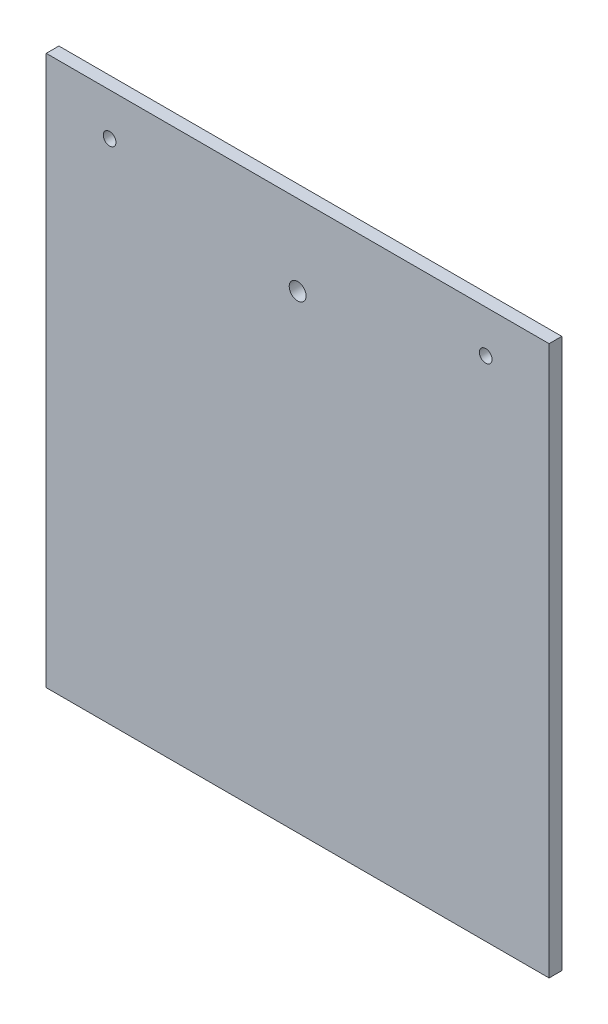
ISO-10303-21;
HEADER;
FILE_DESCRIPTION(('STEP AP214'),'2;1');
FILE_NAME('part.step','',(''),(''),'','','');
FILE_SCHEMA(('AUTOMOTIVE_DESIGN { 1 0 10303 214 1 1 1 1 }'));
ENDSEC;
DATA;
#1=APPLICATION_CONTEXT('core data for automotive mechanical design processes');
#2=APPLICATION_PROTOCOL_DEFINITION('international standard','automotive_design',2000,#1);
#3=PRODUCT_CONTEXT('',#1,'mechanical');
#4=PRODUCT('Part','Part','',(#3));
#5=PRODUCT_RELATED_PRODUCT_CATEGORY('part','',(#4));
#6=PRODUCT_DEFINITION_FORMATION('','',#4);
#7=PRODUCT_DEFINITION_CONTEXT('part definition',#1,'design');
#8=PRODUCT_DEFINITION('design','',#6,#7);
#9=PRODUCT_DEFINITION_SHAPE('','',#8);
#10=(LENGTH_UNIT() NAMED_UNIT(*) SI_UNIT(.MILLI.,.METRE.));
#11=(NAMED_UNIT(*) PLANE_ANGLE_UNIT() SI_UNIT($,.RADIAN.));
#12=(NAMED_UNIT(*) SI_UNIT($,.STERADIAN.) SOLID_ANGLE_UNIT());
#13=UNCERTAINTY_MEASURE_WITH_UNIT(LENGTH_MEASURE(1.E-05),#10,'distance_accuracy_value','');
#14=(GEOMETRIC_REPRESENTATION_CONTEXT(3) GLOBAL_UNCERTAINTY_ASSIGNED_CONTEXT((#13)) GLOBAL_UNIT_ASSIGNED_CONTEXT((#10,
#11,#12)) REPRESENTATION_CONTEXT('',''));
#15=CARTESIAN_POINT('',(0.,0.,0.));
#16=DIRECTION('',(0.,0.,1.));
#17=DIRECTION('',(1.,0.,0.));
#18=AXIS2_PLACEMENT_3D('',#15,#16,#17);
#19=CARTESIAN_POINT('',(0.,0.,3.));
#20=DIRECTION('',(0.,0.,1.));
#21=DIRECTION('',(1.,0.,0.));
#22=AXIS2_PLACEMENT_3D('',#19,#20,#21);
#23=PLANE('',#22);
#24=CARTESIAN_POINT('',(0.,46.,3.));
#25=DIRECTION('',(0.,0.,1.));
#26=DIRECTION('',(1.,0.,0.));
#27=AXIS2_PLACEMENT_3D('',#24,#25,#26);
#28=CIRCLE('',#27,2.);
#29=CARTESIAN_POINT('',(2.,46.,3.));
#30=VERTEX_POINT('',#29);
#31=EDGE_CURVE('E149',#30,#30,#28,.T.);
#32=ORIENTED_EDGE('',*,*,#31,.F.);
#33=EDGE_LOOP('',(#32));
#34=FACE_BOUND('',#33,.T.);
#35=CARTESIAN_POINT('',(-44.5,55.,3.));
#36=DIRECTION('',(0.,0.,-1.));
#37=DIRECTION('',(-1.,0.,0.));
#38=AXIS2_PLACEMENT_3D('',#35,#36,#37);
#39=CIRCLE('',#38,1.5);
#40=CARTESIAN_POINT('',(-46.,55.,3.));
#41=VERTEX_POINT('',#40);
#42=EDGE_CURVE('E137',#41,#41,#39,.T.);
#43=ORIENTED_EDGE('',*,*,#42,.T.);
#44=EDGE_LOOP('',(#43));
#45=FACE_BOUND('',#44,.T.);
#46=DIRECTION('',(0.,-1.,0.));
#47=VECTOR('',#46,1.);
#48=CARTESIAN_POINT('',(-59.5,-65.,3.));
#49=LINE('',#48,#47);
#50=CARTESIAN_POINT('',(-59.5,65.,3.));
#51=VERTEX_POINT('',#50);
#52=CARTESIAN_POINT('',(-59.5,-65.,3.));
#53=VERTEX_POINT('',#52);
#54=EDGE_CURVE('E95',#51,#53,#49,.T.);
#55=ORIENTED_EDGE('',*,*,#54,.T.);
#56=DIRECTION('',(1.,0.,0.));
#57=VECTOR('',#56,1.);
#58=CARTESIAN_POINT('',(59.5,-65.,3.));
#59=LINE('',#58,#57);
#60=CARTESIAN_POINT('',(59.5,-65.,3.));
#61=VERTEX_POINT('',#60);
#62=EDGE_CURVE('E90',#53,#61,#59,.T.);
#63=ORIENTED_EDGE('',*,*,#62,.T.);
#64=DIRECTION('',(0.,1.,0.));
#65=VECTOR('',#64,1.);
#66=CARTESIAN_POINT('',(59.5,-65.,3.));
#67=LINE('',#66,#65);
#68=CARTESIAN_POINT('',(59.5,65.,3.));
#69=VERTEX_POINT('',#68);
#70=EDGE_CURVE('E93',#61,#69,#67,.T.);
#71=ORIENTED_EDGE('',*,*,#70,.T.);
#72=DIRECTION('',(-1.,0.,0.));
#73=VECTOR('',#72,1.);
#74=CARTESIAN_POINT('',(59.5,65.,3.));
#75=LINE('',#74,#73);
#76=EDGE_CURVE('E60',#69,#51,#75,.T.);
#77=ORIENTED_EDGE('',*,*,#76,.T.);
#78=EDGE_LOOP('',(#55,#63,#71,#77));
#79=FACE_BOUND('',#78,.T.);
#80=CARTESIAN_POINT('',(44.5,55.,3.));
#81=DIRECTION('',(0.,0.,1.));
#82=DIRECTION('',(1.,0.,0.));
#83=AXIS2_PLACEMENT_3D('',#80,#81,#82);
#84=CIRCLE('',#83,1.5);
#85=CARTESIAN_POINT('',(46.,55.,3.));
#86=VERTEX_POINT('',#85);
#87=EDGE_CURVE('E142',#86,#86,#84,.T.);
#88=ORIENTED_EDGE('',*,*,#87,.F.);
#89=EDGE_LOOP('',(#88));
#90=FACE_BOUND('',#89,.T.);
#91=ADVANCED_FACE('F42',(#34,#45,#79,#90),#23,.T.);
#92=CARTESIAN_POINT('',(0.,0.,0.));
#93=DIRECTION('',(0.,0.,1.));
#94=DIRECTION('',(1.,0.,0.));
#95=AXIS2_PLACEMENT_3D('',#92,#93,#94);
#96=PLANE('',#95);
#97=CARTESIAN_POINT('',(0.,46.,0.));
#98=DIRECTION('',(0.,0.,1.));
#99=DIRECTION('',(1.,0.,0.));
#100=AXIS2_PLACEMENT_3D('',#97,#98,#99);
#101=CIRCLE('',#100,2.);
#102=CARTESIAN_POINT('',(2.,46.,0.));
#103=VERTEX_POINT('',#102);
#104=EDGE_CURVE('E138',#103,#103,#101,.T.);
#105=ORIENTED_EDGE('',*,*,#104,.T.);
#106=EDGE_LOOP('',(#105));
#107=FACE_BOUND('',#106,.T.);
#108=DIRECTION('',(0.,-1.,0.));
#109=VECTOR('',#108,1.);
#110=CARTESIAN_POINT('',(-59.5,-65.,0.));
#111=LINE('',#110,#109);
#112=CARTESIAN_POINT('',(-59.5,65.,0.));
#113=VERTEX_POINT('',#112);
#114=CARTESIAN_POINT('',(-59.5,-65.,0.));
#115=VERTEX_POINT('',#114);
#116=EDGE_CURVE('E111',#113,#115,#111,.T.);
#117=ORIENTED_EDGE('',*,*,#116,.F.);
#118=DIRECTION('',(-1.,0.,0.));
#119=VECTOR('',#118,1.);
#120=CARTESIAN_POINT('',(59.5,65.,0.));
#121=LINE('',#120,#119);
#122=CARTESIAN_POINT('',(59.5,65.,0.));
#123=VERTEX_POINT('',#122);
#124=EDGE_CURVE('E83',#123,#113,#121,.T.);
#125=ORIENTED_EDGE('',*,*,#124,.F.);
#126=DIRECTION('',(0.,1.,0.));
#127=VECTOR('',#126,1.);
#128=CARTESIAN_POINT('',(59.5,-65.,0.));
#129=LINE('',#128,#127);
#130=CARTESIAN_POINT('',(59.5,-65.,0.));
#131=VERTEX_POINT('',#130);
#132=EDGE_CURVE('E77',#131,#123,#129,.T.);
#133=ORIENTED_EDGE('',*,*,#132,.F.);
#134=DIRECTION('',(1.,0.,0.));
#135=VECTOR('',#134,1.);
#136=CARTESIAN_POINT('',(59.5,-65.,0.));
#137=LINE('',#136,#135);
#138=EDGE_CURVE('E100',#115,#131,#137,.T.);
#139=ORIENTED_EDGE('',*,*,#138,.F.);
#140=EDGE_LOOP('',(#117,#125,#133,#139));
#141=FACE_BOUND('',#140,.T.);
#142=CARTESIAN_POINT('',(-44.5,55.,0.));
#143=DIRECTION('',(0.,0.,-1.));
#144=DIRECTION('',(-1.,0.,0.));
#145=AXIS2_PLACEMENT_3D('',#142,#143,#144);
#146=CIRCLE('',#145,1.5);
#147=CARTESIAN_POINT('',(-46.,55.,0.));
#148=VERTEX_POINT('',#147);
#149=EDGE_CURVE('E133',#148,#148,#146,.T.);
#150=ORIENTED_EDGE('',*,*,#149,.F.);
#151=EDGE_LOOP('',(#150));
#152=FACE_BOUND('',#151,.T.);
#153=CARTESIAN_POINT('',(44.5,55.,0.));
#154=DIRECTION('',(0.,0.,1.));
#155=DIRECTION('',(1.,0.,0.));
#156=AXIS2_PLACEMENT_3D('',#153,#154,#155);
#157=CIRCLE('',#156,1.5);
#158=CARTESIAN_POINT('',(46.,55.,0.));
#159=VERTEX_POINT('',#158);
#160=EDGE_CURVE('E115',#159,#159,#157,.T.);
#161=ORIENTED_EDGE('',*,*,#160,.T.);
#162=EDGE_LOOP('',(#161));
#163=FACE_BOUND('',#162,.T.);
#164=ADVANCED_FACE('F128',(#107,#141,#152,#163),#96,.F.);
#165=CARTESIAN_POINT('',(-59.5,-65.,3.));
#166=DIRECTION('',(1.,0.,0.));
#167=DIRECTION('',(0.,0.,-1.));
#168=AXIS2_PLACEMENT_3D('',#165,#166,#167);
#169=PLANE('',#168);
#170=ORIENTED_EDGE('',*,*,#116,.T.);
#171=DIRECTION('',(0.,0.,-1.));
#172=VECTOR('',#171,1.);
#173=CARTESIAN_POINT('',(-59.5,-65.,3.));
#174=LINE('',#173,#172);
#175=EDGE_CURVE('E11',#53,#115,#174,.T.);
#176=ORIENTED_EDGE('',*,*,#175,.F.);
#177=ORIENTED_EDGE('',*,*,#54,.F.);
#178=DIRECTION('',(0.,0.,-1.));
#179=VECTOR('',#178,1.);
#180=CARTESIAN_POINT('',(-59.5,65.,3.));
#181=LINE('',#180,#179);
#182=EDGE_CURVE('E107',#51,#113,#181,.T.);
#183=ORIENTED_EDGE('',*,*,#182,.T.);
#184=EDGE_LOOP('',(#170,#176,#177,#183));
#185=FACE_BOUND('',#184,.T.);
#186=ADVANCED_FACE('F44',(#185),#169,.F.);
#187=CARTESIAN_POINT('',(59.5,-65.,3.));
#188=DIRECTION('',(0.,1.,0.));
#189=DIRECTION('',(-1.,0.,0.));
#190=AXIS2_PLACEMENT_3D('',#187,#188,#189);
#191=PLANE('',#190);
#192=ORIENTED_EDGE('',*,*,#138,.T.);
#193=DIRECTION('',(0.,0.,-1.));
#194=VECTOR('',#193,1.);
#195=CARTESIAN_POINT('',(59.5,-65.,3.));
#196=LINE('',#195,#194);
#197=EDGE_CURVE('E52',#61,#131,#196,.T.);
#198=ORIENTED_EDGE('',*,*,#197,.F.);
#199=ORIENTED_EDGE('',*,*,#62,.F.);
#200=ORIENTED_EDGE('',*,*,#175,.T.);
#201=EDGE_LOOP('',(#192,#198,#199,#200));
#202=FACE_BOUND('',#201,.T.);
#203=ADVANCED_FACE('F99',(#202),#191,.F.);
#204=CARTESIAN_POINT('',(59.5,-65.,3.));
#205=DIRECTION('',(-1.,0.,0.));
#206=DIRECTION('',(0.,0.,1.));
#207=AXIS2_PLACEMENT_3D('',#204,#205,#206);
#208=PLANE('',#207);
#209=ORIENTED_EDGE('',*,*,#132,.T.);
#210=DIRECTION('',(0.,0.,-1.));
#211=VECTOR('',#210,1.);
#212=CARTESIAN_POINT('',(59.5,65.,3.));
#213=LINE('',#212,#211);
#214=EDGE_CURVE('E102',#69,#123,#213,.T.);
#215=ORIENTED_EDGE('',*,*,#214,.F.);
#216=ORIENTED_EDGE('',*,*,#70,.F.);
#217=ORIENTED_EDGE('',*,*,#197,.T.);
#218=EDGE_LOOP('',(#209,#215,#216,#217));
#219=FACE_BOUND('',#218,.T.);
#220=ADVANCED_FACE('F103',(#219),#208,.F.);
#221=CARTESIAN_POINT('',(59.5,65.,3.));
#222=DIRECTION('',(0.,-1.,0.));
#223=DIRECTION('',(1.,0.,0.));
#224=AXIS2_PLACEMENT_3D('',#221,#222,#223);
#225=PLANE('',#224);
#226=ORIENTED_EDGE('',*,*,#124,.T.);
#227=ORIENTED_EDGE('',*,*,#182,.F.);
#228=ORIENTED_EDGE('',*,*,#76,.F.);
#229=ORIENTED_EDGE('',*,*,#214,.T.);
#230=EDGE_LOOP('',(#226,#227,#228,#229));
#231=FACE_BOUND('',#230,.T.);
#232=ADVANCED_FACE('F125',(#231),#225,.F.);
#233=CARTESIAN_POINT('',(-44.5,55.,0.));
#234=DIRECTION('',(0.,0.,1.));
#235=DIRECTION('',(1.,0.,0.));
#236=AXIS2_PLACEMENT_3D('',#233,#234,#235);
#237=CYLINDRICAL_SURFACE('',#236,1.5);
#238=ORIENTED_EDGE('',*,*,#149,.T.);
#239=EDGE_LOOP('',(#238));
#240=FACE_BOUND('',#239,.T.);
#241=ORIENTED_EDGE('',*,*,#42,.F.);
#242=EDGE_LOOP('',(#241));
#243=FACE_BOUND('',#242,.T.);
#244=ADVANCED_FACE('F170',(#240,#243),#237,.F.);
#245=CARTESIAN_POINT('',(44.5,55.,0.));
#246=DIRECTION('',(0.,0.,1.));
#247=DIRECTION('',(1.,0.,0.));
#248=AXIS2_PLACEMENT_3D('',#245,#246,#247);
#249=CYLINDRICAL_SURFACE('',#248,1.5);
#250=ORIENTED_EDGE('',*,*,#160,.F.);
#251=EDGE_LOOP('',(#250));
#252=FACE_BOUND('',#251,.T.);
#253=ORIENTED_EDGE('',*,*,#87,.T.);
#254=EDGE_LOOP('',(#253));
#255=FACE_BOUND('',#254,.T.);
#256=ADVANCED_FACE('F161',(#252,#255),#249,.F.);
#257=CARTESIAN_POINT('',(0.,46.,0.));
#258=DIRECTION('',(0.,0.,1.));
#259=DIRECTION('',(1.,0.,0.));
#260=AXIS2_PLACEMENT_3D('',#257,#258,#259);
#261=CYLINDRICAL_SURFACE('',#260,2.);
#262=ORIENTED_EDGE('',*,*,#104,.F.);
#263=EDGE_LOOP('',(#262));
#264=FACE_BOUND('',#263,.T.);
#265=ORIENTED_EDGE('',*,*,#31,.T.);
#266=EDGE_LOOP('',(#265));
#267=FACE_BOUND('',#266,.T.);
#268=ADVANCED_FACE('F158',(#264,#267),#261,.F.);
#269=CLOSED_SHELL('',(#91,#164,#186,#203,#220,#232,#244,#256,#268));
#270=MANIFOLD_SOLID_BREP('B2',#269);
#271=ADVANCED_BREP_SHAPE_REPRESENTATION('',(#18,#270),#14);
#272=SHAPE_DEFINITION_REPRESENTATION(#9,#271);
ENDSEC;
END-ISO-10303-21;
